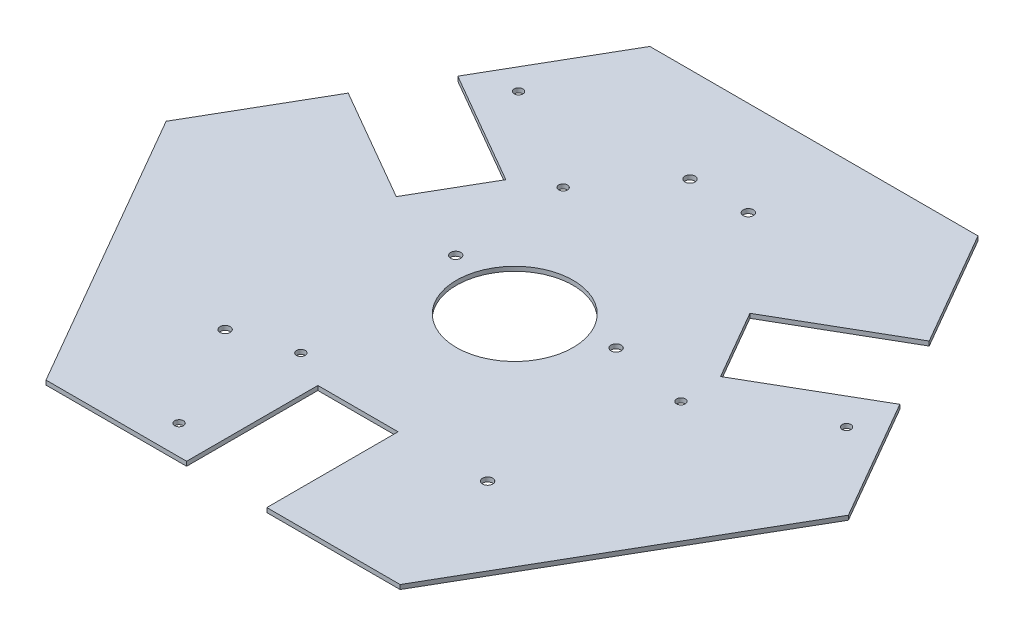
ISO-10303-21;
HEADER;
FILE_DESCRIPTION(('STEP AP214'),'2;1');
FILE_NAME('part.step','',(''),(''),'','','');
FILE_SCHEMA(('AUTOMOTIVE_DESIGN { 1 0 10303 214 1 1 1 1 }'));
ENDSEC;
DATA;
#1=APPLICATION_CONTEXT('core data for automotive mechanical design processes');
#2=APPLICATION_PROTOCOL_DEFINITION('international standard','automotive_design',2000,#1);
#3=PRODUCT_CONTEXT('',#1,'mechanical');
#4=PRODUCT('Part','Part','',(#3));
#5=PRODUCT_RELATED_PRODUCT_CATEGORY('part','',(#4));
#6=PRODUCT_DEFINITION_FORMATION('','',#4);
#7=PRODUCT_DEFINITION_CONTEXT('part definition',#1,'design');
#8=PRODUCT_DEFINITION('design','',#6,#7);
#9=PRODUCT_DEFINITION_SHAPE('','',#8);
#10=(LENGTH_UNIT() NAMED_UNIT(*) SI_UNIT(.MILLI.,.METRE.));
#11=(NAMED_UNIT(*) PLANE_ANGLE_UNIT() SI_UNIT($,.RADIAN.));
#12=(NAMED_UNIT(*) SI_UNIT($,.STERADIAN.) SOLID_ANGLE_UNIT());
#13=UNCERTAINTY_MEASURE_WITH_UNIT(LENGTH_MEASURE(1.E-05),#10,'distance_accuracy_value','');
#14=(GEOMETRIC_REPRESENTATION_CONTEXT(3) GLOBAL_UNCERTAINTY_ASSIGNED_CONTEXT((#13)) GLOBAL_UNIT_ASSIGNED_CONTEXT((#10,
#11,#12)) REPRESENTATION_CONTEXT('',''));
#15=CARTESIAN_POINT('',(0.,0.,0.));
#16=DIRECTION('',(0.,0.,1.));
#17=DIRECTION('',(1.,0.,0.));
#18=AXIS2_PLACEMENT_3D('',#15,#16,#17);
#19=CARTESIAN_POINT('',(-95.2627944162882,3.,-55.0000000000002));
#20=DIRECTION('',(0.866025403784438,0.,0.500000000000001));
#21=DIRECTION('',(0.500000000000001,0.,-0.866025403784438));
#22=AXIS2_PLACEMENT_3D('',#19,#20,#21);
#23=PLANE('',#22);
#24=DIRECTION('',(0.,1.,0.));
#25=VECTOR('',#24,1.);
#26=CARTESIAN_POINT('',(-82.7627944162881,3.,-76.6506350946113));
#27=LINE('',#26,#25);
#28=CARTESIAN_POINT('',(-82.7627944162881,0.,-76.6506350946113));
#29=VERTEX_POINT('',#28);
#30=CARTESIAN_POINT('',(-82.7627944162881,3.,-76.6506350946113));
#31=VERTEX_POINT('',#30);
#32=EDGE_CURVE('E11',#29,#31,#27,.T.);
#33=ORIENTED_EDGE('',*,*,#32,.F.);
#34=DIRECTION('',(0.500000000000001,0.,-0.866025403784438));
#35=VECTOR('',#34,1.);
#36=CARTESIAN_POINT('',(-95.2627944162882,0.,-55.0000000000002));
#37=LINE('',#36,#35);
#38=CARTESIAN_POINT('',(-110.262794416288,0.,-29.0192378864672));
#39=VERTEX_POINT('',#38);
#40=EDGE_CURVE('E141',#39,#29,#37,.T.);
#41=ORIENTED_EDGE('',*,*,#40,.F.);
#42=DIRECTION('',(0.,1.,0.));
#43=VECTOR('',#42,1.);
#44=CARTESIAN_POINT('',(-110.262794416288,3.,-29.0192378864672));
#45=LINE('',#44,#43);
#46=CARTESIAN_POINT('',(-110.262794416288,3.,-29.0192378864672));
#47=VERTEX_POINT('',#46);
#48=EDGE_CURVE('E52',#39,#47,#45,.T.);
#49=ORIENTED_EDGE('',*,*,#48,.T.);
#50=DIRECTION('',(0.500000000000001,0.,-0.866025403784438));
#51=VECTOR('',#50,1.);
#52=CARTESIAN_POINT('',(-95.2627944162882,3.,-55.0000000000002));
#53=LINE('',#52,#51);
#54=EDGE_CURVE('E278',#47,#31,#53,.T.);
#55=ORIENTED_EDGE('',*,*,#54,.T.);
#56=EDGE_LOOP('',(#33,#41,#49,#55));
#57=FACE_BOUND('',#56,.T.);
#58=ADVANCED_FACE('F42',(#57),#23,.F.);
#59=CARTESIAN_POINT('',(-14.9999999999998,3.,25.9807621135328));
#60=DIRECTION('',(0.5,0.,-0.866025403784439));
#61=DIRECTION('',(-0.866025403784439,0.,-0.5));
#62=AXIS2_PLACEMENT_3D('',#59,#60,#61);
#63=PLANE('',#62);
#64=ORIENTED_EDGE('',*,*,#48,.F.);
#65=DIRECTION('',(-0.866025403784439,0.,-0.5));
#66=VECTOR('',#65,1.);
#67=CARTESIAN_POINT('',(-14.9999999999998,0.,25.9807621135328));
#68=LINE('',#67,#66);
#69=CARTESIAN_POINT('',(-188.205080756888,0.,-74.0192378864672));
#70=VERTEX_POINT('',#69);
#71=EDGE_CURVE('E192',#39,#70,#68,.T.);
#72=ORIENTED_EDGE('',*,*,#71,.T.);
#73=DIRECTION('',(0.,1.,0.));
#74=VECTOR('',#73,1.);
#75=CARTESIAN_POINT('',(-188.205080756888,3.,-74.0192378864672));
#76=LINE('',#75,#74);
#77=CARTESIAN_POINT('',(-188.205080756888,3.,-74.0192378864672));
#78=VERTEX_POINT('',#77);
#79=EDGE_CURVE('E271',#70,#78,#76,.T.);
#80=ORIENTED_EDGE('',*,*,#79,.T.);
#81=DIRECTION('',(-0.866025403784439,0.,-0.5));
#82=VECTOR('',#81,1.);
#83=CARTESIAN_POINT('',(-14.9999999999998,3.,25.9807621135328));
#84=LINE('',#83,#82);
#85=EDGE_CURVE('E288',#47,#78,#84,.T.);
#86=ORIENTED_EDGE('',*,*,#85,.F.);
#87=EDGE_LOOP('',(#64,#72,#80,#86));
#88=FACE_BOUND('',#87,.T.);
#89=ADVANCED_FACE('F291',(#88),#63,.T.);
#90=CARTESIAN_POINT('',(-173.205080756888,3.,-100.));
#91=DIRECTION('',(0.866025403784439,0.,0.5));
#92=DIRECTION('',(0.5,0.,-0.866025403784439));
#93=AXIS2_PLACEMENT_3D('',#90,#91,#92);
#94=PLANE('',#93);
#95=ORIENTED_EDGE('',*,*,#79,.F.);
#96=DIRECTION('',(0.5,0.,-0.866025403784439));
#97=VECTOR('',#96,1.);
#98=CARTESIAN_POINT('',(-173.205080756888,0.,-100.));
#99=LINE('',#98,#97);
#100=CARTESIAN_POINT('',(-233.910161513776,0.,5.14428414850129));
#101=VERTEX_POINT('',#100);
#102=EDGE_CURVE('E189',#101,#70,#99,.T.);
#103=ORIENTED_EDGE('',*,*,#102,.F.);
#104=DIRECTION('',(0.,1.,0.));
#105=VECTOR('',#104,1.);
#106=CARTESIAN_POINT('',(-233.910161513776,3.,5.14428414850129));
#107=LINE('',#106,#105);
#108=CARTESIAN_POINT('',(-233.910161513776,3.,5.14428414850129));
#109=VERTEX_POINT('',#108);
#110=EDGE_CURVE('E268',#101,#109,#107,.T.);
#111=ORIENTED_EDGE('',*,*,#110,.T.);
#112=DIRECTION('',(0.5,0.,-0.866025403784439));
#113=VECTOR('',#112,1.);
#114=CARTESIAN_POINT('',(-173.205080756888,3.,-100.));
#115=LINE('',#114,#113);
#116=EDGE_CURVE('E292',#109,#78,#115,.T.);
#117=ORIENTED_EDGE('',*,*,#116,.T.);
#118=EDGE_LOOP('',(#95,#103,#111,#117));
#119=FACE_BOUND('',#118,.T.);
#120=ADVANCED_FACE('F391',(#119),#94,.F.);
#121=CARTESIAN_POINT('',(-177.660161513776,3.,102.572142074251));
#122=DIRECTION('',(-0.866025403784439,0.,0.5));
#123=DIRECTION('',(0.5,0.,0.866025403784439));
#124=AXIS2_PLACEMENT_3D('',#121,#122,#123);
#125=PLANE('',#124);
#126=ORIENTED_EDGE('',*,*,#110,.F.);
#127=DIRECTION('',(0.5,0.,0.866025403784439));
#128=VECTOR('',#127,1.);
#129=CARTESIAN_POINT('',(-177.660161513776,0.,102.572142074251));
#130=LINE('',#129,#128);
#131=CARTESIAN_POINT('',(-121.410161513776,0.,200.));
#132=VERTEX_POINT('',#131);
#133=EDGE_CURVE('E186',#101,#132,#130,.T.);
#134=ORIENTED_EDGE('',*,*,#133,.T.);
#135=DIRECTION('',(0.,1.,0.));
#136=VECTOR('',#135,1.);
#137=CARTESIAN_POINT('',(-121.410161513776,3.,200.));
#138=LINE('',#137,#136);
#139=CARTESIAN_POINT('',(-121.410161513776,3.,200.));
#140=VERTEX_POINT('',#139);
#141=EDGE_CURVE('E265',#132,#140,#138,.T.);
#142=ORIENTED_EDGE('',*,*,#141,.T.);
#143=DIRECTION('',(0.5,0.,0.866025403784439));
#144=VECTOR('',#143,1.);
#145=CARTESIAN_POINT('',(-177.660161513776,3.,102.572142074251));
#146=LINE('',#145,#144);
#147=EDGE_CURVE('E294',#109,#140,#146,.T.);
#148=ORIENTED_EDGE('',*,*,#147,.F.);
#149=EDGE_LOOP('',(#126,#134,#142,#148));
#150=FACE_BOUND('',#149,.T.);
#151=ADVANCED_FACE('F601',(#150),#125,.T.);
#152=CARTESIAN_POINT('',(-1.72734337417305E-13,3.,200.));
#153=DIRECTION('',(0.,0.,-1.));
#154=DIRECTION('',(-1.,0.,0.));
#155=AXIS2_PLACEMENT_3D('',#152,#153,#154);
#156=PLANE('',#155);
#157=ORIENTED_EDGE('',*,*,#141,.F.);
#158=DIRECTION('',(1.,0.,0.));
#159=VECTOR('',#158,1.);
#160=CARTESIAN_POINT('',(0.,0.,200.));
#161=LINE('',#160,#159);
#162=CARTESIAN_POINT('',(-25.,0.,200.));
#163=VERTEX_POINT('',#162);
#164=EDGE_CURVE('E183',#163,#132,#161,.F.);
#165=ORIENTED_EDGE('',*,*,#164,.F.);
#166=DIRECTION('',(0.,1.,0.));
#167=VECTOR('',#166,1.);
#168=CARTESIAN_POINT('',(-25.,3.,200.));
#169=LINE('',#168,#167);
#170=CARTESIAN_POINT('',(-25.,3.,200.));
#171=VERTEX_POINT('',#170);
#172=EDGE_CURVE('E262',#163,#171,#169,.T.);
#173=ORIENTED_EDGE('',*,*,#172,.T.);
#174=DIRECTION('',(-1.,0.,0.));
#175=VECTOR('',#174,1.);
#176=CARTESIAN_POINT('',(-1.72734337417305E-13,3.,200.));
#177=LINE('',#176,#175);
#178=EDGE_CURVE('E300',#171,#140,#177,.T.);
#179=ORIENTED_EDGE('',*,*,#178,.T.);
#180=EDGE_LOOP('',(#157,#165,#173,#179));
#181=FACE_BOUND('',#180,.T.);
#182=ADVANCED_FACE('F591',(#181),#156,.F.);
#183=CARTESIAN_POINT('',(-25.,3.,0.));
#184=DIRECTION('',(-1.,0.,0.));
#185=DIRECTION('',(0.,0.,1.));
#186=AXIS2_PLACEMENT_3D('',#183,#184,#185);
#187=PLANE('',#186);
#188=ORIENTED_EDGE('',*,*,#172,.F.);
#189=DIRECTION('',(0.,0.,1.));
#190=VECTOR('',#189,1.);
#191=CARTESIAN_POINT('',(-25.,0.,0.));
#192=LINE('',#191,#190);
#193=CARTESIAN_POINT('',(-25.,0.,110.));
#194=VERTEX_POINT('',#193);
#195=EDGE_CURVE('E180',#194,#163,#192,.T.);
#196=ORIENTED_EDGE('',*,*,#195,.F.);
#197=DIRECTION('',(0.,1.,0.));
#198=VECTOR('',#197,1.);
#199=CARTESIAN_POINT('',(-25.,3.,110.));
#200=LINE('',#199,#198);
#201=CARTESIAN_POINT('',(-25.,3.,110.));
#202=VERTEX_POINT('',#201);
#203=EDGE_CURVE('E259',#194,#202,#200,.T.);
#204=ORIENTED_EDGE('',*,*,#203,.T.);
#205=DIRECTION('',(0.,0.,1.));
#206=VECTOR('',#205,1.);
#207=CARTESIAN_POINT('',(-25.,3.,0.));
#208=LINE('',#207,#206);
#209=EDGE_CURVE('E303',#202,#171,#208,.T.);
#210=ORIENTED_EDGE('',*,*,#209,.T.);
#211=EDGE_LOOP('',(#188,#196,#204,#210));
#212=FACE_BOUND('',#211,.T.);
#213=ADVANCED_FACE('F581',(#212),#187,.F.);
#214=CARTESIAN_POINT('',(0.,3.,110.));
#215=DIRECTION('',(0.,0.,-1.));
#216=DIRECTION('',(-1.,0.,0.));
#217=AXIS2_PLACEMENT_3D('',#214,#215,#216);
#218=PLANE('',#217);
#219=ORIENTED_EDGE('',*,*,#203,.F.);
#220=DIRECTION('',(1.,0.,0.));
#221=VECTOR('',#220,1.);
#222=CARTESIAN_POINT('',(0.,0.,110.));
#223=LINE('',#222,#221);
#224=CARTESIAN_POINT('',(30.,0.,110.));
#225=VERTEX_POINT('',#224);
#226=EDGE_CURVE('E177',#225,#194,#223,.F.);
#227=ORIENTED_EDGE('',*,*,#226,.F.);
#228=DIRECTION('',(0.,1.,0.));
#229=VECTOR('',#228,1.);
#230=CARTESIAN_POINT('',(30.,3.,110.));
#231=LINE('',#230,#229);
#232=CARTESIAN_POINT('',(30.,3.,110.));
#233=VERTEX_POINT('',#232);
#234=EDGE_CURVE('E256',#225,#233,#231,.T.);
#235=ORIENTED_EDGE('',*,*,#234,.T.);
#236=DIRECTION('',(-1.,0.,0.));
#237=VECTOR('',#236,1.);
#238=CARTESIAN_POINT('',(0.,3.,110.));
#239=LINE('',#238,#237);
#240=EDGE_CURVE('E306',#233,#202,#239,.T.);
#241=ORIENTED_EDGE('',*,*,#240,.T.);
#242=EDGE_LOOP('',(#219,#227,#235,#241));
#243=FACE_BOUND('',#242,.T.);
#244=ADVANCED_FACE('F571',(#243),#218,.F.);
#245=CARTESIAN_POINT('',(30.,3.,0.));
#246=DIRECTION('',(-1.,0.,0.));
#247=DIRECTION('',(0.,0.,1.));
#248=AXIS2_PLACEMENT_3D('',#245,#246,#247);
#249=PLANE('',#248);
#250=ORIENTED_EDGE('',*,*,#234,.F.);
#251=DIRECTION('',(0.,0.,1.));
#252=VECTOR('',#251,1.);
#253=CARTESIAN_POINT('',(30.,0.,0.));
#254=LINE('',#253,#252);
#255=CARTESIAN_POINT('',(30.,0.,200.));
#256=VERTEX_POINT('',#255);
#257=EDGE_CURVE('E174',#225,#256,#254,.T.);
#258=ORIENTED_EDGE('',*,*,#257,.T.);
#259=DIRECTION('',(0.,1.,0.));
#260=VECTOR('',#259,1.);
#261=CARTESIAN_POINT('',(30.,3.,200.));
#262=LINE('',#261,#260);
#263=CARTESIAN_POINT('',(30.,3.,200.));
#264=VERTEX_POINT('',#263);
#265=EDGE_CURVE('E253',#256,#264,#262,.T.);
#266=ORIENTED_EDGE('',*,*,#265,.T.);
#267=DIRECTION('',(0.,0.,1.));
#268=VECTOR('',#267,1.);
#269=CARTESIAN_POINT('',(30.,3.,0.));
#270=LINE('',#269,#268);
#271=EDGE_CURVE('E309',#233,#264,#270,.T.);
#272=ORIENTED_EDGE('',*,*,#271,.F.);
#273=EDGE_LOOP('',(#250,#258,#266,#272));
#274=FACE_BOUND('',#273,.T.);
#275=ADVANCED_FACE('F561',(#274),#249,.T.);
#276=CARTESIAN_POINT('',(1.21455099328081E-13,3.,200.));
#277=DIRECTION('',(0.,0.,-1.));
#278=DIRECTION('',(-1.,0.,0.));
#279=AXIS2_PLACEMENT_3D('',#276,#277,#278);
#280=PLANE('',#279);
#281=ORIENTED_EDGE('',*,*,#265,.F.);
#282=DIRECTION('',(1.,0.,0.));
#283=VECTOR('',#282,1.);
#284=CARTESIAN_POINT('',(0.,0.,200.));
#285=LINE('',#284,#283);
#286=CARTESIAN_POINT('',(121.410161513775,0.,200.));
#287=VERTEX_POINT('',#286);
#288=EDGE_CURVE('E171',#287,#256,#285,.F.);
#289=ORIENTED_EDGE('',*,*,#288,.F.);
#290=DIRECTION('',(0.,1.,0.));
#291=VECTOR('',#290,1.);
#292=CARTESIAN_POINT('',(121.410161513775,3.,200.));
#293=LINE('',#292,#291);
#294=CARTESIAN_POINT('',(121.410161513775,3.,200.));
#295=VERTEX_POINT('',#294);
#296=EDGE_CURVE('E250',#287,#295,#293,.T.);
#297=ORIENTED_EDGE('',*,*,#296,.T.);
#298=DIRECTION('',(-1.,0.,0.));
#299=VECTOR('',#298,1.);
#300=CARTESIAN_POINT('',(1.21455099328081E-13,3.,200.));
#301=LINE('',#300,#299);
#302=EDGE_CURVE('E312',#295,#264,#301,.T.);
#303=ORIENTED_EDGE('',*,*,#302,.T.);
#304=EDGE_LOOP('',(#281,#289,#297,#303));
#305=FACE_BOUND('',#304,.T.);
#306=ADVANCED_FACE('F551',(#305),#280,.F.);
#307=CARTESIAN_POINT('',(177.660161513775,3.,102.572142074251));
#308=DIRECTION('',(-0.866025403784439,0.,-0.5));
#309=DIRECTION('',(-0.5,0.,0.866025403784439));
#310=AXIS2_PLACEMENT_3D('',#307,#308,#309);
#311=PLANE('',#310);
#312=ORIENTED_EDGE('',*,*,#296,.F.);
#313=DIRECTION('',(-0.5,0.,0.866025403784439));
#314=VECTOR('',#313,1.);
#315=CARTESIAN_POINT('',(177.660161513775,0.,102.572142074251));
#316=LINE('',#315,#314);
#317=CARTESIAN_POINT('',(233.910161513775,0.,5.14428414850127));
#318=VERTEX_POINT('',#317);
#319=EDGE_CURVE('E168',#318,#287,#316,.T.);
#320=ORIENTED_EDGE('',*,*,#319,.F.);
#321=DIRECTION('',(0.,1.,0.));
#322=VECTOR('',#321,1.);
#323=CARTESIAN_POINT('',(233.910161513775,3.,5.14428414850127));
#324=LINE('',#323,#322);
#325=CARTESIAN_POINT('',(233.910161513775,3.,5.14428414850127));
#326=VERTEX_POINT('',#325);
#327=EDGE_CURVE('E247',#318,#326,#324,.T.);
#328=ORIENTED_EDGE('',*,*,#327,.T.);
#329=DIRECTION('',(-0.5,0.,0.866025403784439));
#330=VECTOR('',#329,1.);
#331=CARTESIAN_POINT('',(177.660161513775,3.,102.572142074251));
#332=LINE('',#331,#330);
#333=EDGE_CURVE('E315',#326,#295,#332,.T.);
#334=ORIENTED_EDGE('',*,*,#333,.T.);
#335=EDGE_LOOP('',(#312,#320,#328,#334));
#336=FACE_BOUND('',#335,.T.);
#337=ADVANCED_FACE('F541',(#336),#311,.F.);
#338=CARTESIAN_POINT('',(173.205080756888,3.,-100.));
#339=DIRECTION('',(-0.866025403784439,0.,0.5));
#340=DIRECTION('',(0.5,0.,0.866025403784439));
#341=AXIS2_PLACEMENT_3D('',#338,#339,#340);
#342=PLANE('',#341);
#343=ORIENTED_EDGE('',*,*,#327,.F.);
#344=DIRECTION('',(0.5,0.,0.866025403784439));
#345=VECTOR('',#344,1.);
#346=CARTESIAN_POINT('',(173.205080756888,0.,-100.));
#347=LINE('',#346,#345);
#348=CARTESIAN_POINT('',(185.705080756888,0.,-78.3493649053891));
#349=VERTEX_POINT('',#348);
#350=EDGE_CURVE('E165',#349,#318,#347,.T.);
#351=ORIENTED_EDGE('',*,*,#350,.F.);
#352=DIRECTION('',(0.,1.,0.));
#353=VECTOR('',#352,1.);
#354=CARTESIAN_POINT('',(185.705080756888,3.,-78.3493649053891));
#355=LINE('',#354,#353);
#356=CARTESIAN_POINT('',(185.705080756888,3.,-78.3493649053891));
#357=VERTEX_POINT('',#356);
#358=EDGE_CURVE('E244',#349,#357,#355,.T.);
#359=ORIENTED_EDGE('',*,*,#358,.T.);
#360=DIRECTION('',(0.5,0.,0.866025403784439));
#361=VECTOR('',#360,1.);
#362=CARTESIAN_POINT('',(173.205080756888,3.,-100.));
#363=LINE('',#362,#361);
#364=EDGE_CURVE('E318',#357,#326,#363,.T.);
#365=ORIENTED_EDGE('',*,*,#364,.T.);
#366=EDGE_LOOP('',(#343,#351,#359,#365));
#367=FACE_BOUND('',#366,.T.);
#368=ADVANCED_FACE('F531',(#367),#342,.F.);
#369=CARTESIAN_POINT('',(12.5,3.,21.650635094611));
#370=DIRECTION('',(0.5,0.,0.866025403784439));
#371=DIRECTION('',(0.866025403784439,0.,-0.5));
#372=AXIS2_PLACEMENT_3D('',#369,#370,#371);
#373=PLANE('',#372);
#374=ORIENTED_EDGE('',*,*,#358,.F.);
#375=DIRECTION('',(0.866025403784439,0.,-0.5));
#376=VECTOR('',#375,1.);
#377=CARTESIAN_POINT('',(12.5,0.,21.650635094611));
#378=LINE('',#377,#376);
#379=CARTESIAN_POINT('',(107.762794416288,0.,-33.3493649053891));
#380=VERTEX_POINT('',#379);
#381=EDGE_CURVE('E162',#380,#349,#378,.T.);
#382=ORIENTED_EDGE('',*,*,#381,.F.);
#383=DIRECTION('',(0.,1.,0.));
#384=VECTOR('',#383,1.);
#385=CARTESIAN_POINT('',(107.762794416288,3.,-33.3493649053891));
#386=LINE('',#385,#384);
#387=CARTESIAN_POINT('',(107.762794416288,3.,-33.3493649053891));
#388=VERTEX_POINT('',#387);
#389=EDGE_CURVE('E241',#380,#388,#386,.T.);
#390=ORIENTED_EDGE('',*,*,#389,.T.);
#391=DIRECTION('',(0.866025403784439,0.,-0.5));
#392=VECTOR('',#391,1.);
#393=CARTESIAN_POINT('',(12.5,3.,21.650635094611));
#394=LINE('',#393,#392);
#395=EDGE_CURVE('E321',#388,#357,#394,.T.);
#396=ORIENTED_EDGE('',*,*,#395,.T.);
#397=EDGE_LOOP('',(#374,#382,#390,#396));
#398=FACE_BOUND('',#397,.T.);
#399=ADVANCED_FACE('F521',(#398),#373,.F.);
#400=CARTESIAN_POINT('',(95.2627944162883,3.,-55.));
#401=DIRECTION('',(-0.866025403784439,0.,0.5));
#402=DIRECTION('',(0.5,0.,0.866025403784439));
#403=AXIS2_PLACEMENT_3D('',#400,#401,#402);
#404=PLANE('',#403);
#405=ORIENTED_EDGE('',*,*,#389,.F.);
#406=DIRECTION('',(0.5,0.,0.866025403784439));
#407=VECTOR('',#406,1.);
#408=CARTESIAN_POINT('',(95.2627944162883,0.,-55.));
#409=LINE('',#408,#407);
#410=CARTESIAN_POINT('',(80.2627944162883,0.,-80.9807621135332));
#411=VERTEX_POINT('',#410);
#412=EDGE_CURVE('E159',#411,#380,#409,.T.);
#413=ORIENTED_EDGE('',*,*,#412,.F.);
#414=DIRECTION('',(0.,1.,0.));
#415=VECTOR('',#414,1.);
#416=CARTESIAN_POINT('',(80.2627944162883,3.,-80.9807621135332));
#417=LINE('',#416,#415);
#418=CARTESIAN_POINT('',(80.2627944162883,3.,-80.9807621135332));
#419=VERTEX_POINT('',#418);
#420=EDGE_CURVE('E238',#411,#419,#417,.T.);
#421=ORIENTED_EDGE('',*,*,#420,.T.);
#422=DIRECTION('',(0.5,0.,0.866025403784439));
#423=VECTOR('',#422,1.);
#424=CARTESIAN_POINT('',(95.2627944162883,3.,-55.));
#425=LINE('',#424,#423);
#426=EDGE_CURVE('E324',#419,#388,#425,.T.);
#427=ORIENTED_EDGE('',*,*,#426,.T.);
#428=EDGE_LOOP('',(#405,#413,#421,#427));
#429=FACE_BOUND('',#428,.T.);
#430=ADVANCED_FACE('F511',(#429),#404,.F.);
#431=CARTESIAN_POINT('',(-15.,3.,-25.9807621135332));
#432=DIRECTION('',(-0.5,0.,-0.866025403784439));
#433=DIRECTION('',(-0.866025403784439,0.,0.5));
#434=AXIS2_PLACEMENT_3D('',#431,#432,#433);
#435=PLANE('',#434);
#436=ORIENTED_EDGE('',*,*,#420,.F.);
#437=DIRECTION('',(-0.866025403784439,0.,0.5));
#438=VECTOR('',#437,1.);
#439=CARTESIAN_POINT('',(-15.,0.,-25.9807621135332));
#440=LINE('',#439,#438);
#441=CARTESIAN_POINT('',(158.205080756888,0.,-125.980762113533));
#442=VERTEX_POINT('',#441);
#443=EDGE_CURVE('E156',#442,#411,#440,.T.);
#444=ORIENTED_EDGE('',*,*,#443,.F.);
#445=DIRECTION('',(0.,1.,0.));
#446=VECTOR('',#445,1.);
#447=CARTESIAN_POINT('',(158.205080756888,3.,-125.980762113533));
#448=LINE('',#447,#446);
#449=CARTESIAN_POINT('',(158.205080756888,3.,-125.980762113533));
#450=VERTEX_POINT('',#449);
#451=EDGE_CURVE('E235',#442,#450,#448,.T.);
#452=ORIENTED_EDGE('',*,*,#451,.T.);
#453=DIRECTION('',(-0.866025403784439,0.,0.5));
#454=VECTOR('',#453,1.);
#455=CARTESIAN_POINT('',(-15.,3.,-25.9807621135332));
#456=LINE('',#455,#454);
#457=EDGE_CURVE('E327',#450,#419,#456,.T.);
#458=ORIENTED_EDGE('',*,*,#457,.T.);
#459=EDGE_LOOP('',(#436,#444,#452,#458));
#460=FACE_BOUND('',#459,.T.);
#461=ADVANCED_FACE('F501',(#460),#435,.F.);
#462=CARTESIAN_POINT('',(173.205080756888,3.,-100.));
#463=DIRECTION('',(-0.866025403784439,0.,0.5));
#464=DIRECTION('',(0.5,0.,0.866025403784439));
#465=AXIS2_PLACEMENT_3D('',#462,#463,#464);
#466=PLANE('',#465);
#467=ORIENTED_EDGE('',*,*,#451,.F.);
#468=DIRECTION('',(0.5,0.,0.866025403784439));
#469=VECTOR('',#468,1.);
#470=CARTESIAN_POINT('',(173.205080756888,0.,-100.));
#471=LINE('',#470,#469);
#472=CARTESIAN_POINT('',(112.5,0.,-205.144284148501));
#473=VERTEX_POINT('',#472);
#474=EDGE_CURVE('E153',#473,#442,#471,.T.);
#475=ORIENTED_EDGE('',*,*,#474,.F.);
#476=DIRECTION('',(0.,1.,0.));
#477=VECTOR('',#476,1.);
#478=CARTESIAN_POINT('',(112.5,3.,-205.144284148501));
#479=LINE('',#478,#477);
#480=CARTESIAN_POINT('',(112.5,3.,-205.144284148501));
#481=VERTEX_POINT('',#480);
#482=EDGE_CURVE('E233',#473,#481,#479,.T.);
#483=ORIENTED_EDGE('',*,*,#482,.T.);
#484=DIRECTION('',(0.5,0.,0.866025403784439));
#485=VECTOR('',#484,1.);
#486=CARTESIAN_POINT('',(173.205080756888,3.,-100.));
#487=LINE('',#486,#485);
#488=EDGE_CURVE('E330',#481,#450,#487,.T.);
#489=ORIENTED_EDGE('',*,*,#488,.T.);
#490=EDGE_LOOP('',(#467,#475,#483,#489));
#491=FACE_BOUND('',#490,.T.);
#492=ADVANCED_FACE('F492',(#491),#466,.F.);
#493=CARTESIAN_POINT('',(0.,3.,-205.144284148501));
#494=DIRECTION('',(0.,0.,1.));
#495=DIRECTION('',(1.,0.,0.));
#496=AXIS2_PLACEMENT_3D('',#493,#494,#495);
#497=PLANE('',#496);
#498=ORIENTED_EDGE('',*,*,#482,.F.);
#499=DIRECTION('',(1.,0.,0.));
#500=VECTOR('',#499,1.);
#501=CARTESIAN_POINT('',(0.,0.,-205.144284148501));
#502=LINE('',#501,#500);
#503=CARTESIAN_POINT('',(-112.5,0.,-205.144284148501));
#504=VERTEX_POINT('',#503);
#505=EDGE_CURVE('E150',#504,#473,#502,.T.);
#506=ORIENTED_EDGE('',*,*,#505,.F.);
#507=DIRECTION('',(0.,1.,0.));
#508=VECTOR('',#507,1.);
#509=CARTESIAN_POINT('',(-112.5,3.,-205.144284148501));
#510=LINE('',#509,#508);
#511=CARTESIAN_POINT('',(-112.5,3.,-205.144284148501));
#512=VERTEX_POINT('',#511);
#513=EDGE_CURVE('E60',#504,#512,#510,.T.);
#514=ORIENTED_EDGE('',*,*,#513,.T.);
#515=DIRECTION('',(1.,0.,0.));
#516=VECTOR('',#515,1.);
#517=CARTESIAN_POINT('',(0.,3.,-205.144284148501));
#518=LINE('',#517,#516);
#519=EDGE_CURVE('E333',#512,#481,#518,.T.);
#520=ORIENTED_EDGE('',*,*,#519,.T.);
#521=EDGE_LOOP('',(#498,#506,#514,#520));
#522=FACE_BOUND('',#521,.T.);
#523=ADVANCED_FACE('F483',(#522),#497,.F.);
#524=CARTESIAN_POINT('',(-173.205080756888,3.,-100.));
#525=DIRECTION('',(0.866025403784438,0.,0.500000000000001));
#526=DIRECTION('',(0.500000000000001,0.,-0.866025403784438));
#527=AXIS2_PLACEMENT_3D('',#524,#525,#526);
#528=PLANE('',#527);
#529=ORIENTED_EDGE('',*,*,#513,.F.);
#530=DIRECTION('',(0.500000000000001,0.,-0.866025403784438));
#531=VECTOR('',#530,1.);
#532=CARTESIAN_POINT('',(-173.205080756888,0.,-100.));
#533=LINE('',#532,#531);
#534=CARTESIAN_POINT('',(-160.705080756888,0.,-121.650635094611));
#535=VERTEX_POINT('',#534);
#536=EDGE_CURVE('E139',#535,#504,#533,.T.);
#537=ORIENTED_EDGE('',*,*,#536,.F.);
#538=DIRECTION('',(0.,1.,0.));
#539=VECTOR('',#538,1.);
#540=CARTESIAN_POINT('',(-160.705080756888,3.,-121.650635094611));
#541=LINE('',#540,#539);
#542=CARTESIAN_POINT('',(-160.705080756888,3.,-121.650635094611));
#543=VERTEX_POINT('',#542);
#544=EDGE_CURVE('E46',#535,#543,#541,.T.);
#545=ORIENTED_EDGE('',*,*,#544,.T.);
#546=DIRECTION('',(0.500000000000001,0.,-0.866025403784438));
#547=VECTOR('',#546,1.);
#548=CARTESIAN_POINT('',(-173.205080756888,3.,-100.));
#549=LINE('',#548,#547);
#550=EDGE_CURVE('E902',#543,#512,#549,.T.);
#551=ORIENTED_EDGE('',*,*,#550,.T.);
#552=EDGE_LOOP('',(#529,#537,#545,#551));
#553=FACE_BOUND('',#552,.T.);
#554=ADVANCED_FACE('F143',(#553),#528,.F.);
#555=CARTESIAN_POINT('',(55.0000000000003,3.,-14.5225058835907));
#556=DIRECTION('',(0.,1.,0.));
#557=DIRECTION('',(0.,0.,1.));
#558=AXIS2_PLACEMENT_3D('',#555,#556,#557);
#559=CYLINDRICAL_SURFACE('',#558,3.5);
#560=CARTESIAN_POINT('',(55.0000000000003,3.,-14.5225058835907));
#561=DIRECTION('',(0.,1.,0.));
#562=DIRECTION('',(0.,0.,1.));
#563=AXIS2_PLACEMENT_3D('',#560,#561,#562);
#564=CIRCLE('',#563,3.5);
#565=CARTESIAN_POINT('',(55.0000000000003,3.,-11.0225058835907));
#566=VERTEX_POINT('',#565);
#567=EDGE_CURVE('E231',#566,#566,#564,.F.);
#568=ORIENTED_EDGE('',*,*,#567,.F.);
#569=EDGE_LOOP('',(#568));
#570=FACE_BOUND('',#569,.T.);
#571=CARTESIAN_POINT('',(55.0000000000003,0.,-14.5225058835907));
#572=DIRECTION('',(0.,1.,0.));
#573=DIRECTION('',(0.,0.,1.));
#574=AXIS2_PLACEMENT_3D('',#571,#572,#573);
#575=CIRCLE('',#574,3.5);
#576=CARTESIAN_POINT('',(55.0000000000003,0.,-11.0225058835907));
#577=VERTEX_POINT('',#576);
#578=EDGE_CURVE('E144',#577,#577,#575,.F.);
#579=ORIENTED_EDGE('',*,*,#578,.T.);
#580=EDGE_LOOP('',(#579));
#581=FACE_BOUND('',#580,.T.);
#582=ADVANCED_FACE('F398',(#570,#581),#559,.F.);
#583=CARTESIAN_POINT('',(12.5000000000002,3.,-21.6506350946113));
#584=DIRECTION('',(0.5,0.,-0.866025403784439));
#585=DIRECTION('',(-0.866025403784439,0.,-0.5));
#586=AXIS2_PLACEMENT_3D('',#583,#584,#585);
#587=PLANE('',#586);
#588=DIRECTION('',(-0.866025403784439,0.,-0.5));
#589=VECTOR('',#588,1.);
#590=CARTESIAN_POINT('',(12.5000000000002,0.,-21.6506350946113));
#591=LINE('',#590,#589);
#592=EDGE_CURVE('E127',#29,#535,#591,.T.);
#593=ORIENTED_EDGE('',*,*,#592,.F.);
#594=ORIENTED_EDGE('',*,*,#32,.T.);
#595=DIRECTION('',(-0.866025403784439,0.,-0.5));
#596=VECTOR('',#595,1.);
#597=CARTESIAN_POINT('',(12.5000000000002,3.,-21.6506350946113));
#598=LINE('',#597,#596);
#599=EDGE_CURVE('E129',#31,#543,#598,.T.);
#600=ORIENTED_EDGE('',*,*,#599,.T.);
#601=ORIENTED_EDGE('',*,*,#544,.F.);
#602=EDGE_LOOP('',(#593,#594,#600,#601));
#603=FACE_BOUND('',#602,.T.);
#604=ADVANCED_FACE('F126',(#603),#587,.F.);
#605=CARTESIAN_POINT('',(0.,3.,0.));
#606=DIRECTION('',(0.,1.,0.));
#607=DIRECTION('',(0.,0.,1.));
#608=AXIS2_PLACEMENT_3D('',#605,#606,#607);
#609=CYLINDRICAL_SURFACE('',#608,40.);
#610=CARTESIAN_POINT('',(0.,3.,0.));
#611=DIRECTION('',(0.,1.,0.));
#612=DIRECTION('',(0.,0.,1.));
#613=AXIS2_PLACEMENT_3D('',#610,#611,#612);
#614=CIRCLE('',#613,40.);
#615=CARTESIAN_POINT('',(0.,3.,40.));
#616=VERTEX_POINT('',#615);
#617=EDGE_CURVE('E335',#616,#616,#614,.T.);
#618=ORIENTED_EDGE('',*,*,#617,.T.);
#619=EDGE_LOOP('',(#618));
#620=FACE_BOUND('',#619,.T.);
#621=CARTESIAN_POINT('',(0.,0.,0.));
#622=DIRECTION('',(0.,1.,0.));
#623=DIRECTION('',(0.,0.,1.));
#624=AXIS2_PLACEMENT_3D('',#621,#622,#623);
#625=CIRCLE('',#624,40.);
#626=CARTESIAN_POINT('',(0.,0.,40.));
#627=VERTEX_POINT('',#626);
#628=EDGE_CURVE('E152',#627,#627,#625,.T.);
#629=ORIENTED_EDGE('',*,*,#628,.F.);
#630=EDGE_LOOP('',(#629));
#631=FACE_BOUND('',#630,.T.);
#632=ADVANCED_FACE('F397',(#620,#631),#609,.F.);
#633=CARTESIAN_POINT('',(-50.14,3.,96.51));
#634=DIRECTION('',(0.,1.,0.));
#635=DIRECTION('',(0.,0.,1.));
#636=AXIS2_PLACEMENT_3D('',#633,#634,#635);
#637=CYLINDRICAL_SURFACE('',#636,3.);
#638=CARTESIAN_POINT('',(-50.14,3.,96.51));
#639=DIRECTION('',(0.,1.,0.));
#640=DIRECTION('',(0.,0.,1.));
#641=AXIS2_PLACEMENT_3D('',#638,#639,#640);
#642=CIRCLE('',#641,3.);
#643=CARTESIAN_POINT('',(-50.14,3.,99.51));
#644=VERTEX_POINT('',#643);
#645=EDGE_CURVE('E338',#644,#644,#642,.T.);
#646=ORIENTED_EDGE('',*,*,#645,.T.);
#647=EDGE_LOOP('',(#646));
#648=FACE_BOUND('',#647,.T.);
#649=CARTESIAN_POINT('',(-50.14,0.,96.51));
#650=DIRECTION('',(0.,1.,0.));
#651=DIRECTION('',(0.,0.,1.));
#652=AXIS2_PLACEMENT_3D('',#649,#650,#651);
#653=CIRCLE('',#652,3.);
#654=CARTESIAN_POINT('',(-50.14,0.,99.51));
#655=VERTEX_POINT('',#654);
#656=EDGE_CURVE('E198',#655,#655,#653,.T.);
#657=ORIENTED_EDGE('',*,*,#656,.F.);
#658=EDGE_LOOP('',(#657));
#659=FACE_BOUND('',#658,.T.);
#660=ADVANCED_FACE('F401',(#648,#659),#637,.F.);
#661=CARTESIAN_POINT('',(-50.14,3.,180.));
#662=DIRECTION('',(0.,1.,0.));
#663=DIRECTION('',(0.,0.,1.));
#664=AXIS2_PLACEMENT_3D('',#661,#662,#663);
#665=CYLINDRICAL_SURFACE('',#664,3.);
#666=CARTESIAN_POINT('',(-50.14,3.,180.));
#667=DIRECTION('',(0.,1.,0.));
#668=DIRECTION('',(0.,0.,1.));
#669=AXIS2_PLACEMENT_3D('',#666,#667,#668);
#670=CIRCLE('',#669,3.);
#671=CARTESIAN_POINT('',(-50.14,3.,183.));
#672=VERTEX_POINT('',#671);
#673=EDGE_CURVE('E341',#672,#672,#670,.T.);
#674=ORIENTED_EDGE('',*,*,#673,.T.);
#675=EDGE_LOOP('',(#674));
#676=FACE_BOUND('',#675,.T.);
#677=CARTESIAN_POINT('',(-50.14,0.,180.));
#678=DIRECTION('',(0.,1.,0.));
#679=DIRECTION('',(0.,0.,1.));
#680=AXIS2_PLACEMENT_3D('',#677,#678,#679);
#681=CIRCLE('',#680,3.);
#682=CARTESIAN_POINT('',(-50.14,0.,183.));
#683=VERTEX_POINT('',#682);
#684=EDGE_CURVE('E201',#683,#683,#681,.T.);
#685=ORIENTED_EDGE('',*,*,#684,.F.);
#686=EDGE_LOOP('',(#685));
#687=FACE_BOUND('',#686,.T.);
#688=ADVANCED_FACE('F405',(#676,#687),#665,.F.);
#689=CARTESIAN_POINT('',(108.953220610561,3.,-5.00748625424825));
#690=DIRECTION('',(0.,1.,0.));
#691=DIRECTION('',(0.,0.,1.));
#692=AXIS2_PLACEMENT_3D('',#689,#690,#691);
#693=CYLINDRICAL_SURFACE('',#692,3.0000000000006);
#694=CARTESIAN_POINT('',(108.953220610561,3.,-5.00748625424825));
#695=DIRECTION('',(0.,1.,0.));
#696=DIRECTION('',(0.,0.,1.));
#697=AXIS2_PLACEMENT_3D('',#694,#695,#696);
#698=CIRCLE('',#697,3.0000000000006);
#699=CARTESIAN_POINT('',(108.953220610561,3.,-2.00748625424765));
#700=VERTEX_POINT('',#699);
#701=EDGE_CURVE('E344',#700,#700,#698,.T.);
#702=ORIENTED_EDGE('',*,*,#701,.T.);
#703=EDGE_LOOP('',(#702));
#704=FACE_BOUND('',#703,.T.);
#705=CARTESIAN_POINT('',(108.953220610561,0.,-5.00748625424825));
#706=DIRECTION('',(0.,1.,0.));
#707=DIRECTION('',(0.,0.,1.));
#708=AXIS2_PLACEMENT_3D('',#705,#706,#707);
#709=CIRCLE('',#708,3.0000000000006);
#710=CARTESIAN_POINT('',(108.953220610561,0.,-2.00748625424765));
#711=VERTEX_POINT('',#710);
#712=EDGE_CURVE('E204',#711,#711,#709,.T.);
#713=ORIENTED_EDGE('',*,*,#712,.F.);
#714=EDGE_LOOP('',(#713));
#715=FACE_BOUND('',#714,.T.);
#716=ADVANCED_FACE('F409',(#704,#715),#693,.F.);
#717=CARTESIAN_POINT('',(180.954572681199,3.,-46.5774862542483));
#718=DIRECTION('',(0.,1.,0.));
#719=DIRECTION('',(0.,0.,1.));
#720=AXIS2_PLACEMENT_3D('',#717,#718,#719);
#721=CYLINDRICAL_SURFACE('',#720,3.00000000000057);
#722=CARTESIAN_POINT('',(180.954572681199,3.,-46.5774862542483));
#723=DIRECTION('',(0.,1.,0.));
#724=DIRECTION('',(0.,0.,1.));
#725=AXIS2_PLACEMENT_3D('',#722,#723,#724);
#726=CIRCLE('',#725,3.00000000000057);
#727=CARTESIAN_POINT('',(180.954572681199,3.,-43.5774862542477));
#728=VERTEX_POINT('',#727);
#729=EDGE_CURVE('E347',#728,#728,#726,.T.);
#730=ORIENTED_EDGE('',*,*,#729,.T.);
#731=EDGE_LOOP('',(#730));
#732=FACE_BOUND('',#731,.T.);
#733=CARTESIAN_POINT('',(180.954572681199,0.,-46.5774862542483));
#734=DIRECTION('',(0.,1.,0.));
#735=DIRECTION('',(0.,0.,1.));
#736=AXIS2_PLACEMENT_3D('',#733,#734,#735);
#737=CIRCLE('',#736,3.00000000000057);
#738=CARTESIAN_POINT('',(180.954572681199,0.,-43.5774862542477));
#739=VERTEX_POINT('',#738);
#740=EDGE_CURVE('E207',#739,#739,#737,.T.);
#741=ORIENTED_EDGE('',*,*,#740,.F.);
#742=EDGE_LOOP('',(#741));
#743=FACE_BOUND('',#742,.T.);
#744=ADVANCED_FACE('F413',(#732,#743),#721,.F.);
#745=CARTESIAN_POINT('',(-58.5101117192361,3.,-91.677513745752));
#746=DIRECTION('',(0.,1.,0.));
#747=DIRECTION('',(0.,0.,1.));
#748=AXIS2_PLACEMENT_3D('',#745,#746,#747);
#749=CYLINDRICAL_SURFACE('',#748,3.);
#750=CARTESIAN_POINT('',(-58.5101117192361,3.,-91.677513745752));
#751=DIRECTION('',(0.,1.,0.));
#752=DIRECTION('',(0.,0.,1.));
#753=AXIS2_PLACEMENT_3D('',#750,#751,#752);
#754=CIRCLE('',#753,3.);
#755=CARTESIAN_POINT('',(-58.5101117192361,3.,-88.677513745752));
#756=VERTEX_POINT('',#755);
#757=EDGE_CURVE('E350',#756,#756,#754,.T.);
#758=ORIENTED_EDGE('',*,*,#757,.T.);
#759=EDGE_LOOP('',(#758));
#760=FACE_BOUND('',#759,.T.);
#761=CARTESIAN_POINT('',(-58.5101117192361,0.,-91.677513745752));
#762=DIRECTION('',(0.,1.,0.));
#763=DIRECTION('',(0.,0.,1.));
#764=AXIS2_PLACEMENT_3D('',#761,#762,#763);
#765=CIRCLE('',#764,3.);
#766=CARTESIAN_POINT('',(-58.5101117192361,0.,-88.677513745752));
#767=VERTEX_POINT('',#766);
#768=EDGE_CURVE('E210',#767,#767,#765,.T.);
#769=ORIENTED_EDGE('',*,*,#768,.F.);
#770=EDGE_LOOP('',(#769));
#771=FACE_BOUND('',#770,.T.);
#772=ADVANCED_FACE('F417',(#760,#771),#749,.F.);
#773=CARTESIAN_POINT('',(-130.814572681199,3.,-133.422513745752));
#774=DIRECTION('',(0.,1.,0.));
#775=DIRECTION('',(0.,0.,1.));
#776=AXIS2_PLACEMENT_3D('',#773,#774,#775);
#777=CYLINDRICAL_SURFACE('',#776,2.99999999999999);
#778=CARTESIAN_POINT('',(-130.814572681199,3.,-133.422513745752));
#779=DIRECTION('',(0.,1.,0.));
#780=DIRECTION('',(0.,0.,1.));
#781=AXIS2_PLACEMENT_3D('',#778,#779,#780);
#782=CIRCLE('',#781,2.99999999999999);
#783=CARTESIAN_POINT('',(-130.814572681199,3.,-130.422513745752));
#784=VERTEX_POINT('',#783);
#785=EDGE_CURVE('E353',#784,#784,#782,.T.);
#786=ORIENTED_EDGE('',*,*,#785,.T.);
#787=EDGE_LOOP('',(#786));
#788=FACE_BOUND('',#787,.T.);
#789=CARTESIAN_POINT('',(-130.814572681199,0.,-133.422513745752));
#790=DIRECTION('',(0.,1.,0.));
#791=DIRECTION('',(0.,0.,1.));
#792=AXIS2_PLACEMENT_3D('',#789,#790,#791);
#793=CIRCLE('',#792,2.99999999999999);
#794=CARTESIAN_POINT('',(-130.814572681199,0.,-130.422513745752));
#795=VERTEX_POINT('',#794);
#796=EDGE_CURVE('E213',#795,#795,#793,.T.);
#797=ORIENTED_EDGE('',*,*,#796,.F.);
#798=EDGE_LOOP('',(#797));
#799=FACE_BOUND('',#798,.T.);
#800=ADVANCED_FACE('F421',(#788,#799),#777,.F.);
#801=CARTESIAN_POINT('',(-20.,3.,-140.144284148501));
#802=DIRECTION('',(0.,1.,0.));
#803=DIRECTION('',(0.,0.,1.));
#804=AXIS2_PLACEMENT_3D('',#801,#802,#803);
#805=CYLINDRICAL_SURFACE('',#804,3.5);
#806=CARTESIAN_POINT('',(-20.,3.,-140.144284148501));
#807=DIRECTION('',(0.,1.,0.));
#808=DIRECTION('',(0.,0.,1.));
#809=AXIS2_PLACEMENT_3D('',#806,#807,#808);
#810=CIRCLE('',#809,3.5);
#811=CARTESIAN_POINT('',(-20.,3.,-136.644284148501));
#812=VERTEX_POINT('',#811);
#813=EDGE_CURVE('E356',#812,#812,#810,.T.);
#814=ORIENTED_EDGE('',*,*,#813,.T.);
#815=EDGE_LOOP('',(#814));
#816=FACE_BOUND('',#815,.T.);
#817=CARTESIAN_POINT('',(-20.,0.,-140.144284148501));
#818=DIRECTION('',(0.,1.,0.));
#819=DIRECTION('',(0.,0.,1.));
#820=AXIS2_PLACEMENT_3D('',#817,#818,#819);
#821=CIRCLE('',#820,3.5);
#822=CARTESIAN_POINT('',(-20.,0.,-136.644284148501));
#823=VERTEX_POINT('',#822);
#824=EDGE_CURVE('E216',#823,#823,#821,.T.);
#825=ORIENTED_EDGE('',*,*,#824,.F.);
#826=EDGE_LOOP('',(#825));
#827=FACE_BOUND('',#826,.T.);
#828=ADVANCED_FACE('F425',(#816,#827),#805,.F.);
#829=CARTESIAN_POINT('',(-55.0000000000003,3.,-14.5225058835907));
#830=DIRECTION('',(0.,1.,0.));
#831=DIRECTION('',(0.,0.,1.));
#832=AXIS2_PLACEMENT_3D('',#829,#830,#831);
#833=CYLINDRICAL_SURFACE('',#832,3.5);
#834=CARTESIAN_POINT('',(-55.0000000000003,3.,-14.5225058835907));
#835=DIRECTION('',(0.,1.,0.));
#836=DIRECTION('',(0.,0.,1.));
#837=AXIS2_PLACEMENT_3D('',#834,#835,#836);
#838=CIRCLE('',#837,3.5);
#839=CARTESIAN_POINT('',(-55.0000000000003,3.,-11.0225058835907));
#840=VERTEX_POINT('',#839);
#841=EDGE_CURVE('E359',#840,#840,#838,.T.);
#842=ORIENTED_EDGE('',*,*,#841,.T.);
#843=EDGE_LOOP('',(#842));
#844=FACE_BOUND('',#843,.T.);
#845=CARTESIAN_POINT('',(-55.0000000000003,0.,-14.5225058835907));
#846=DIRECTION('',(0.,1.,0.));
#847=DIRECTION('',(0.,0.,1.));
#848=AXIS2_PLACEMENT_3D('',#845,#846,#847);
#849=CIRCLE('',#848,3.5);
#850=CARTESIAN_POINT('',(-55.0000000000003,0.,-11.0225058835907));
#851=VERTEX_POINT('',#850);
#852=EDGE_CURVE('E219',#851,#851,#849,.T.);
#853=ORIENTED_EDGE('',*,*,#852,.F.);
#854=EDGE_LOOP('',(#853));
#855=FACE_BOUND('',#854,.T.);
#856=ADVANCED_FACE('F429',(#844,#855),#833,.F.);
#857=CARTESIAN_POINT('',(-90.0000000000006,3.,108.59927238132));
#858=DIRECTION('',(0.,1.,0.));
#859=DIRECTION('',(0.,0.,1.));
#860=AXIS2_PLACEMENT_3D('',#857,#858,#859);
#861=CYLINDRICAL_SURFACE('',#860,3.50000000000001);
#862=CARTESIAN_POINT('',(-90.0000000000006,3.,108.59927238132));
#863=DIRECTION('',(0.,1.,0.));
#864=DIRECTION('',(0.,0.,1.));
#865=AXIS2_PLACEMENT_3D('',#862,#863,#864);
#866=CIRCLE('',#865,3.50000000000001);
#867=CARTESIAN_POINT('',(-90.0000000000006,3.,112.09927238132));
#868=VERTEX_POINT('',#867);
#869=EDGE_CURVE('E362',#868,#868,#866,.T.);
#870=ORIENTED_EDGE('',*,*,#869,.T.);
#871=EDGE_LOOP('',(#870));
#872=FACE_BOUND('',#871,.T.);
#873=CARTESIAN_POINT('',(-90.0000000000006,0.,108.59927238132));
#874=DIRECTION('',(0.,1.,0.));
#875=DIRECTION('',(0.,0.,1.));
#876=AXIS2_PLACEMENT_3D('',#873,#874,#875);
#877=CIRCLE('',#876,3.50000000000001);
#878=CARTESIAN_POINT('',(-90.0000000000006,0.,112.09927238132));
#879=VERTEX_POINT('',#878);
#880=EDGE_CURVE('E222',#879,#879,#877,.T.);
#881=ORIENTED_EDGE('',*,*,#880,.F.);
#882=EDGE_LOOP('',(#881));
#883=FACE_BOUND('',#882,.T.);
#884=ADVANCED_FACE('F433',(#872,#883),#861,.F.);
#885=CARTESIAN_POINT('',(90.0000000000006,3.,108.59927238132));
#886=DIRECTION('',(0.,1.,0.));
#887=DIRECTION('',(0.,0.,1.));
#888=AXIS2_PLACEMENT_3D('',#885,#886,#887);
#889=CYLINDRICAL_SURFACE('',#888,3.50000000000001);
#890=CARTESIAN_POINT('',(90.0000000000006,3.,108.59927238132));
#891=DIRECTION('',(0.,1.,0.));
#892=DIRECTION('',(0.,0.,1.));
#893=AXIS2_PLACEMENT_3D('',#890,#891,#892);
#894=CIRCLE('',#893,3.50000000000001);
#895=CARTESIAN_POINT('',(90.0000000000006,3.,112.09927238132));
#896=VERTEX_POINT('',#895);
#897=EDGE_CURVE('E365',#896,#896,#894,.F.);
#898=ORIENTED_EDGE('',*,*,#897,.F.);
#899=EDGE_LOOP('',(#898));
#900=FACE_BOUND('',#899,.T.);
#901=CARTESIAN_POINT('',(90.0000000000006,0.,108.59927238132));
#902=DIRECTION('',(0.,1.,0.));
#903=DIRECTION('',(0.,0.,1.));
#904=AXIS2_PLACEMENT_3D('',#901,#902,#903);
#905=CIRCLE('',#904,3.50000000000001);
#906=CARTESIAN_POINT('',(90.0000000000006,0.,112.09927238132));
#907=VERTEX_POINT('',#906);
#908=EDGE_CURVE('E225',#907,#907,#905,.F.);
#909=ORIENTED_EDGE('',*,*,#908,.T.);
#910=EDGE_LOOP('',(#909));
#911=FACE_BOUND('',#910,.T.);
#912=ADVANCED_FACE('F373',(#900,#911),#889,.F.);
#913=CARTESIAN_POINT('',(20.,3.,-140.144284148501));
#914=DIRECTION('',(0.,1.,0.));
#915=DIRECTION('',(0.,0.,1.));
#916=AXIS2_PLACEMENT_3D('',#913,#914,#915);
#917=CYLINDRICAL_SURFACE('',#916,3.5);
#918=CARTESIAN_POINT('',(20.,3.,-140.144284148501));
#919=DIRECTION('',(0.,1.,0.));
#920=DIRECTION('',(0.,0.,1.));
#921=AXIS2_PLACEMENT_3D('',#918,#919,#920);
#922=CIRCLE('',#921,3.5);
#923=CARTESIAN_POINT('',(20.,3.,-136.644284148501));
#924=VERTEX_POINT('',#923);
#925=EDGE_CURVE('E133',#924,#924,#922,.F.);
#926=ORIENTED_EDGE('',*,*,#925,.F.);
#927=EDGE_LOOP('',(#926));
#928=FACE_BOUND('',#927,.T.);
#929=CARTESIAN_POINT('',(20.,0.,-140.144284148501));
#930=DIRECTION('',(0.,1.,0.));
#931=DIRECTION('',(0.,0.,1.));
#932=AXIS2_PLACEMENT_3D('',#929,#930,#931);
#933=CIRCLE('',#932,3.5);
#934=CARTESIAN_POINT('',(20.,0.,-136.644284148501));
#935=VERTEX_POINT('',#934);
#936=EDGE_CURVE('E228',#935,#935,#933,.F.);
#937=ORIENTED_EDGE('',*,*,#936,.T.);
#938=EDGE_LOOP('',(#937));
#939=FACE_BOUND('',#938,.T.);
#940=ADVANCED_FACE('F44',(#928,#939),#917,.F.);
#941=CARTESIAN_POINT('',(0.,3.,0.));
#942=DIRECTION('',(0.,1.,0.));
#943=DIRECTION('',(0.,0.,1.));
#944=AXIS2_PLACEMENT_3D('',#941,#942,#943);
#945=PLANE('',#944);
#946=ORIENTED_EDGE('',*,*,#567,.T.);
#947=EDGE_LOOP('',(#946));
#948=FACE_BOUND('',#947,.T.);
#949=ORIENTED_EDGE('',*,*,#550,.F.);
#950=ORIENTED_EDGE('',*,*,#599,.F.);
#951=ORIENTED_EDGE('',*,*,#54,.F.);
#952=ORIENTED_EDGE('',*,*,#85,.T.);
#953=ORIENTED_EDGE('',*,*,#116,.F.);
#954=ORIENTED_EDGE('',*,*,#147,.T.);
#955=ORIENTED_EDGE('',*,*,#178,.F.);
#956=ORIENTED_EDGE('',*,*,#209,.F.);
#957=ORIENTED_EDGE('',*,*,#240,.F.);
#958=ORIENTED_EDGE('',*,*,#271,.T.);
#959=ORIENTED_EDGE('',*,*,#302,.F.);
#960=ORIENTED_EDGE('',*,*,#333,.F.);
#961=ORIENTED_EDGE('',*,*,#364,.F.);
#962=ORIENTED_EDGE('',*,*,#395,.F.);
#963=ORIENTED_EDGE('',*,*,#426,.F.);
#964=ORIENTED_EDGE('',*,*,#457,.F.);
#965=ORIENTED_EDGE('',*,*,#488,.F.);
#966=ORIENTED_EDGE('',*,*,#519,.F.);
#967=EDGE_LOOP('',(#949,#950,#951,#952,#953,#954,#955,#956,#957,#958,#959,#960,#961,#962,#963,
#964,#965,#966));
#968=FACE_BOUND('',#967,.T.);
#969=ORIENTED_EDGE('',*,*,#617,.F.);
#970=EDGE_LOOP('',(#969));
#971=FACE_BOUND('',#970,.T.);
#972=ORIENTED_EDGE('',*,*,#645,.F.);
#973=EDGE_LOOP('',(#972));
#974=FACE_BOUND('',#973,.T.);
#975=ORIENTED_EDGE('',*,*,#673,.F.);
#976=EDGE_LOOP('',(#975));
#977=FACE_BOUND('',#976,.T.);
#978=ORIENTED_EDGE('',*,*,#701,.F.);
#979=EDGE_LOOP('',(#978));
#980=FACE_BOUND('',#979,.T.);
#981=ORIENTED_EDGE('',*,*,#729,.F.);
#982=EDGE_LOOP('',(#981));
#983=FACE_BOUND('',#982,.T.);
#984=ORIENTED_EDGE('',*,*,#757,.F.);
#985=EDGE_LOOP('',(#984));
#986=FACE_BOUND('',#985,.T.);
#987=ORIENTED_EDGE('',*,*,#785,.F.);
#988=EDGE_LOOP('',(#987));
#989=FACE_BOUND('',#988,.T.);
#990=ORIENTED_EDGE('',*,*,#813,.F.);
#991=EDGE_LOOP('',(#990));
#992=FACE_BOUND('',#991,.T.);
#993=ORIENTED_EDGE('',*,*,#841,.F.);
#994=EDGE_LOOP('',(#993));
#995=FACE_BOUND('',#994,.T.);
#996=ORIENTED_EDGE('',*,*,#869,.F.);
#997=EDGE_LOOP('',(#996));
#998=FACE_BOUND('',#997,.T.);
#999=ORIENTED_EDGE('',*,*,#897,.T.);
#1000=EDGE_LOOP('',(#999));
#1001=FACE_BOUND('',#1000,.T.);
#1002=ORIENTED_EDGE('',*,*,#925,.T.);
#1003=EDGE_LOOP('',(#1002));
#1004=FACE_BOUND('',#1003,.T.);
#1005=ADVANCED_FACE('F285',(#948,#968,#971,#974,#977,#980,#983,#986,#989,#992,#995,#998,#1001,
#1004),#945,.T.);
#1006=CARTESIAN_POINT('',(0.,0.,0.));
#1007=DIRECTION('',(0.,1.,0.));
#1008=DIRECTION('',(0.,0.,1.));
#1009=AXIS2_PLACEMENT_3D('',#1006,#1007,#1008);
#1010=PLANE('',#1009);
#1011=ORIENTED_EDGE('',*,*,#578,.F.);
#1012=EDGE_LOOP('',(#1011));
#1013=FACE_BOUND('',#1012,.T.);
#1014=ORIENTED_EDGE('',*,*,#536,.T.);
#1015=ORIENTED_EDGE('',*,*,#505,.T.);
#1016=ORIENTED_EDGE('',*,*,#474,.T.);
#1017=ORIENTED_EDGE('',*,*,#443,.T.);
#1018=ORIENTED_EDGE('',*,*,#412,.T.);
#1019=ORIENTED_EDGE('',*,*,#381,.T.);
#1020=ORIENTED_EDGE('',*,*,#350,.T.);
#1021=ORIENTED_EDGE('',*,*,#319,.T.);
#1022=ORIENTED_EDGE('',*,*,#288,.T.);
#1023=ORIENTED_EDGE('',*,*,#257,.F.);
#1024=ORIENTED_EDGE('',*,*,#226,.T.);
#1025=ORIENTED_EDGE('',*,*,#195,.T.);
#1026=ORIENTED_EDGE('',*,*,#164,.T.);
#1027=ORIENTED_EDGE('',*,*,#133,.F.);
#1028=ORIENTED_EDGE('',*,*,#102,.T.);
#1029=ORIENTED_EDGE('',*,*,#71,.F.);
#1030=ORIENTED_EDGE('',*,*,#40,.T.);
#1031=ORIENTED_EDGE('',*,*,#592,.T.);
#1032=EDGE_LOOP('',(#1014,#1015,#1016,#1017,#1018,#1019,#1020,#1021,#1022,#1023,#1024,#1025,
#1026,#1027,#1028,#1029,#1030,#1031));
#1033=FACE_BOUND('',#1032,.T.);
#1034=ORIENTED_EDGE('',*,*,#628,.T.);
#1035=EDGE_LOOP('',(#1034));
#1036=FACE_BOUND('',#1035,.T.);
#1037=ORIENTED_EDGE('',*,*,#656,.T.);
#1038=EDGE_LOOP('',(#1037));
#1039=FACE_BOUND('',#1038,.T.);
#1040=ORIENTED_EDGE('',*,*,#684,.T.);
#1041=EDGE_LOOP('',(#1040));
#1042=FACE_BOUND('',#1041,.T.);
#1043=ORIENTED_EDGE('',*,*,#712,.T.);
#1044=EDGE_LOOP('',(#1043));
#1045=FACE_BOUND('',#1044,.T.);
#1046=ORIENTED_EDGE('',*,*,#740,.T.);
#1047=EDGE_LOOP('',(#1046));
#1048=FACE_BOUND('',#1047,.T.);
#1049=ORIENTED_EDGE('',*,*,#768,.T.);
#1050=EDGE_LOOP('',(#1049));
#1051=FACE_BOUND('',#1050,.T.);
#1052=ORIENTED_EDGE('',*,*,#796,.T.);
#1053=EDGE_LOOP('',(#1052));
#1054=FACE_BOUND('',#1053,.T.);
#1055=ORIENTED_EDGE('',*,*,#824,.T.);
#1056=EDGE_LOOP('',(#1055));
#1057=FACE_BOUND('',#1056,.T.);
#1058=ORIENTED_EDGE('',*,*,#852,.T.);
#1059=EDGE_LOOP('',(#1058));
#1060=FACE_BOUND('',#1059,.T.);
#1061=ORIENTED_EDGE('',*,*,#880,.T.);
#1062=EDGE_LOOP('',(#1061));
#1063=FACE_BOUND('',#1062,.T.);
#1064=ORIENTED_EDGE('',*,*,#908,.F.);
#1065=EDGE_LOOP('',(#1064));
#1066=FACE_BOUND('',#1065,.T.);
#1067=ORIENTED_EDGE('',*,*,#936,.F.);
#1068=EDGE_LOOP('',(#1067));
#1069=FACE_BOUND('',#1068,.T.);
#1070=ADVANCED_FACE('F136',(#1013,#1033,#1036,#1039,#1042,#1045,#1048,#1051,#1054,#1057,#1060,
#1063,#1066,#1069),#1010,.F.);
#1071=CLOSED_SHELL('',(#58,#89,#120,#151,#182,#213,#244,#275,#306,#337,#368,#399,#430,#461,#492,
#523,#554,#582,#604,#632,#660,#688,#716,#744,#772,#800,#828,#856,#884,#912,#940,#1005,#1070));
#1072=MANIFOLD_SOLID_BREP('B2',#1071);
#1073=ADVANCED_BREP_SHAPE_REPRESENTATION('',(#18,#1072),#14);
#1074=SHAPE_DEFINITION_REPRESENTATION(#9,#1073);
ENDSEC;
END-ISO-10303-21;
